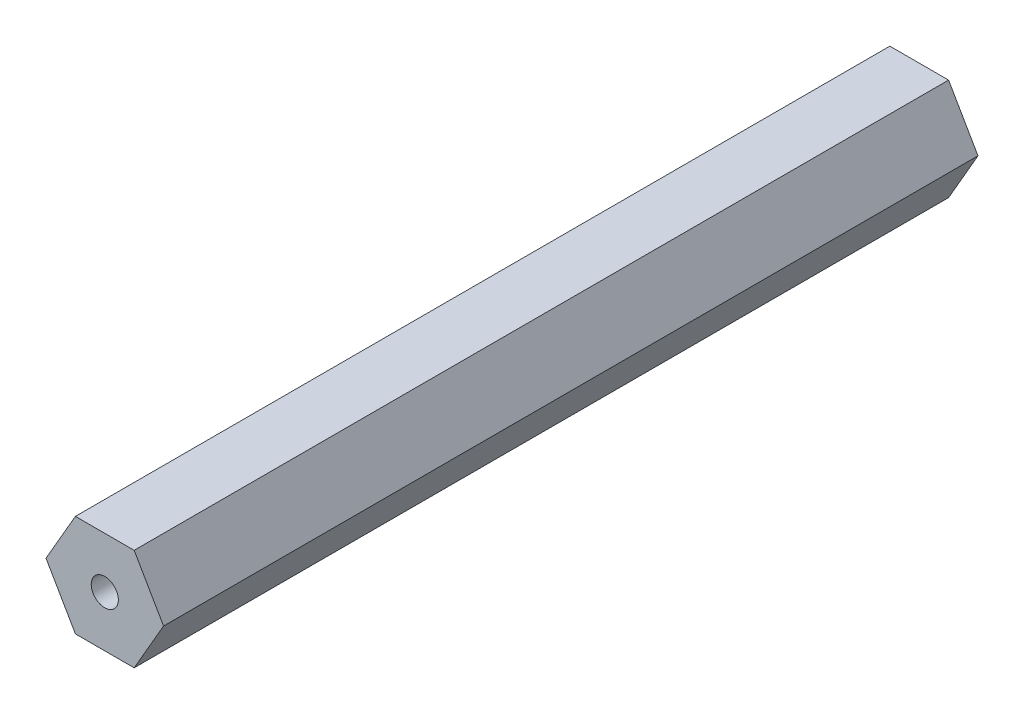
ISO-10303-21;
HEADER;
FILE_DESCRIPTION(('STEP AP214'),'2;1');
FILE_NAME('part.step','',(''),(''),'','','');
FILE_SCHEMA(('AUTOMOTIVE_DESIGN { 1 0 10303 214 1 1 1 1 }'));
ENDSEC;
DATA;
#1=APPLICATION_CONTEXT('core data for automotive mechanical design processes');
#2=APPLICATION_PROTOCOL_DEFINITION('international standard','automotive_design',2000,#1);
#3=PRODUCT_CONTEXT('',#1,'mechanical');
#4=PRODUCT('Part','Part','',(#3));
#5=PRODUCT_RELATED_PRODUCT_CATEGORY('part','',(#4));
#6=PRODUCT_DEFINITION_FORMATION('','',#4);
#7=PRODUCT_DEFINITION_CONTEXT('part definition',#1,'design');
#8=PRODUCT_DEFINITION('design','',#6,#7);
#9=PRODUCT_DEFINITION_SHAPE('','',#8);
#10=(LENGTH_UNIT() NAMED_UNIT(*) SI_UNIT(.MILLI.,.METRE.));
#11=(NAMED_UNIT(*) PLANE_ANGLE_UNIT() SI_UNIT($,.RADIAN.));
#12=(NAMED_UNIT(*) SI_UNIT($,.STERADIAN.) SOLID_ANGLE_UNIT());
#13=UNCERTAINTY_MEASURE_WITH_UNIT(LENGTH_MEASURE(1.E-05),#10,'distance_accuracy_value','');
#14=(GEOMETRIC_REPRESENTATION_CONTEXT(3) GLOBAL_UNCERTAINTY_ASSIGNED_CONTEXT((#13)) GLOBAL_UNIT_ASSIGNED_CONTEXT((#10,
#11,#12)) REPRESENTATION_CONTEXT('',''));
#15=CARTESIAN_POINT('',(0.,0.,0.));
#16=DIRECTION('',(0.,0.,1.));
#17=DIRECTION('',(1.,0.,0.));
#18=AXIS2_PLACEMENT_3D('',#15,#16,#17);
#19=CARTESIAN_POINT('',(0.,0.,76.2));
#20=DIRECTION('',(0.,0.,1.));
#21=DIRECTION('',(1.,0.,0.));
#22=AXIS2_PLACEMENT_3D('',#19,#20,#21);
#23=PLANE('',#22);
#24=DIRECTION('',(0.5,0.866025403784439,0.));
#25=VECTOR('',#24,1.);
#26=CARTESIAN_POINT('',(13.6584086693048,-7.43009006412703,76.2));
#27=LINE('',#26,#25);
#28=CARTESIAN_POINT('',(13.6584086693048,-7.43009006412703,76.2));
#29=VERTEX_POINT('',#28);
#30=CARTESIAN_POINT('',(16.4080393263204,-2.66759006412703,76.2));
#31=VERTEX_POINT('',#30);
#32=EDGE_CURVE('E133',#29,#31,#27,.T.);
#33=ORIENTED_EDGE('',*,*,#32,.T.);
#34=DIRECTION('',(-0.5,0.866025403784439,0.));
#35=VECTOR('',#34,1.);
#36=CARTESIAN_POINT('',(16.4080393263204,-2.66759006412703,76.2));
#37=LINE('',#36,#35);
#38=CARTESIAN_POINT('',(13.6584086693048,2.09490993587297,76.2));
#39=VERTEX_POINT('',#38);
#40=EDGE_CURVE('E91',#31,#39,#37,.T.);
#41=ORIENTED_EDGE('',*,*,#40,.T.);
#42=DIRECTION('',(-1.,0.,0.));
#43=VECTOR('',#42,1.);
#44=CARTESIAN_POINT('',(13.6584086693048,2.09490993587297,76.2));
#45=LINE('',#44,#43);
#46=CARTESIAN_POINT('',(8.1591473552736,2.09490993587297,76.2));
#47=VERTEX_POINT('',#46);
#48=EDGE_CURVE('E104',#39,#47,#45,.T.);
#49=ORIENTED_EDGE('',*,*,#48,.T.);
#50=DIRECTION('',(-0.5,-0.866025403784439,0.));
#51=VECTOR('',#50,1.);
#52=CARTESIAN_POINT('',(8.1591473552736,2.09490993587297,76.2));
#53=LINE('',#52,#51);
#54=CARTESIAN_POINT('',(5.40951669825801,-2.66759006412703,76.2));
#55=VERTEX_POINT('',#54);
#56=EDGE_CURVE('E98',#47,#55,#53,.T.);
#57=ORIENTED_EDGE('',*,*,#56,.T.);
#58=DIRECTION('',(0.5,-0.866025403784438,0.));
#59=VECTOR('',#58,1.);
#60=CARTESIAN_POINT('',(5.40951669825801,-2.66759006412703,76.2));
#61=LINE('',#60,#59);
#62=CARTESIAN_POINT('',(8.1591473552736,-7.43009006412703,76.2));
#63=VERTEX_POINT('',#62);
#64=EDGE_CURVE('E102',#55,#63,#61,.T.);
#65=ORIENTED_EDGE('',*,*,#64,.T.);
#66=DIRECTION('',(1.,0.,0.));
#67=VECTOR('',#66,1.);
#68=CARTESIAN_POINT('',(8.1591473552736,-7.43009006412703,76.2));
#69=LINE('',#68,#67);
#70=EDGE_CURVE('E54',#63,#29,#69,.T.);
#71=ORIENTED_EDGE('',*,*,#70,.T.);
#72=EDGE_LOOP('',(#33,#41,#49,#57,#65,#71));
#73=FACE_BOUND('',#72,.T.);
#74=CARTESIAN_POINT('',(10.9087780122892,-2.66759006412703,76.2));
#75=DIRECTION('',(0.,0.,1.));
#76=DIRECTION('',(1.,0.,0.));
#77=AXIS2_PLACEMENT_3D('',#74,#75,#76);
#78=CIRCLE('',#77,1.27);
#79=CARTESIAN_POINT('',(9.63877801228919,-2.66759006412703,76.2));
#80=VERTEX_POINT('',#79);
#81=EDGE_CURVE('E126',#80,#80,#78,.T.);
#82=ORIENTED_EDGE('',*,*,#81,.F.);
#83=EDGE_LOOP('',(#82));
#84=FACE_BOUND('',#83,.T.);
#85=ADVANCED_FACE('F37',(#73,#84),#23,.T.);
#86=CARTESIAN_POINT('',(0.,0.,0.));
#87=DIRECTION('',(0.,0.,1.));
#88=DIRECTION('',(1.,0.,0.));
#89=AXIS2_PLACEMENT_3D('',#86,#87,#88);
#90=PLANE('',#89);
#91=DIRECTION('',(0.5,0.866025403784439,0.));
#92=VECTOR('',#91,1.);
#93=CARTESIAN_POINT('',(13.6584086693048,-7.43009006412703,0.));
#94=LINE('',#93,#92);
#95=CARTESIAN_POINT('',(13.6584086693048,-7.43009006412703,0.));
#96=VERTEX_POINT('',#95);
#97=CARTESIAN_POINT('',(16.4080393263204,-2.66759006412703,0.));
#98=VERTEX_POINT('',#97);
#99=EDGE_CURVE('E122',#96,#98,#94,.T.);
#100=ORIENTED_EDGE('',*,*,#99,.F.);
#101=DIRECTION('',(1.,0.,0.));
#102=VECTOR('',#101,1.);
#103=CARTESIAN_POINT('',(8.1591473552736,-7.43009006412703,0.));
#104=LINE('',#103,#102);
#105=CARTESIAN_POINT('',(8.1591473552736,-7.43009006412703,0.));
#106=VERTEX_POINT('',#105);
#107=EDGE_CURVE('E83',#106,#96,#104,.T.);
#108=ORIENTED_EDGE('',*,*,#107,.F.);
#109=DIRECTION('',(0.5,-0.866025403784438,0.));
#110=VECTOR('',#109,1.);
#111=CARTESIAN_POINT('',(5.40951669825801,-2.66759006412703,0.));
#112=LINE('',#111,#110);
#113=CARTESIAN_POINT('',(5.40951669825801,-2.66759006412703,0.));
#114=VERTEX_POINT('',#113);
#115=EDGE_CURVE('E77',#114,#106,#112,.T.);
#116=ORIENTED_EDGE('',*,*,#115,.F.);
#117=DIRECTION('',(-0.5,-0.866025403784439,0.));
#118=VECTOR('',#117,1.);
#119=CARTESIAN_POINT('',(8.1591473552736,2.09490993587297,0.));
#120=LINE('',#119,#118);
#121=CARTESIAN_POINT('',(8.1591473552736,2.09490993587297,0.));
#122=VERTEX_POINT('',#121);
#123=EDGE_CURVE('E112',#122,#114,#120,.T.);
#124=ORIENTED_EDGE('',*,*,#123,.F.);
#125=DIRECTION('',(-1.,0.,0.));
#126=VECTOR('',#125,1.);
#127=CARTESIAN_POINT('',(13.6584086693048,2.09490993587297,0.));
#128=LINE('',#127,#126);
#129=CARTESIAN_POINT('',(13.6584086693048,2.09490993587297,0.));
#130=VERTEX_POINT('',#129);
#131=EDGE_CURVE('E128',#130,#122,#128,.T.);
#132=ORIENTED_EDGE('',*,*,#131,.F.);
#133=DIRECTION('',(-0.5,0.866025403784439,0.));
#134=VECTOR('',#133,1.);
#135=CARTESIAN_POINT('',(16.4080393263204,-2.66759006412703,0.));
#136=LINE('',#135,#134);
#137=EDGE_CURVE('E125',#98,#130,#136,.T.);
#138=ORIENTED_EDGE('',*,*,#137,.F.);
#139=EDGE_LOOP('',(#100,#108,#116,#124,#132,#138));
#140=FACE_BOUND('',#139,.T.);
#141=CARTESIAN_POINT('',(10.9087780122892,-2.66759006412703,0.));
#142=DIRECTION('',(0.,0.,1.));
#143=DIRECTION('',(1.,0.,0.));
#144=AXIS2_PLACEMENT_3D('',#141,#142,#143);
#145=CIRCLE('',#144,1.27);
#146=CARTESIAN_POINT('',(9.63877801228919,-2.66759006412703,0.));
#147=VERTEX_POINT('',#146);
#148=EDGE_CURVE('E244',#147,#147,#145,.T.);
#149=ORIENTED_EDGE('',*,*,#148,.T.);
#150=EDGE_LOOP('',(#149));
#151=FACE_BOUND('',#150,.T.);
#152=ADVANCED_FACE('F142',(#140,#151),#90,.F.);
#153=CARTESIAN_POINT('',(13.6584086693048,-7.43009006412703,76.2));
#154=DIRECTION('',(-0.866025403784439,0.5,0.));
#155=DIRECTION('',(-0.5,-0.866025403784439,0.));
#156=AXIS2_PLACEMENT_3D('',#153,#154,#155);
#157=PLANE('',#156);
#158=ORIENTED_EDGE('',*,*,#99,.T.);
#159=DIRECTION('',(0.,0.,-1.));
#160=VECTOR('',#159,1.);
#161=CARTESIAN_POINT('',(16.4080393263204,-2.66759006412703,76.2));
#162=LINE('',#161,#160);
#163=EDGE_CURVE('E11',#31,#98,#162,.T.);
#164=ORIENTED_EDGE('',*,*,#163,.F.);
#165=ORIENTED_EDGE('',*,*,#32,.F.);
#166=DIRECTION('',(0.,0.,-1.));
#167=VECTOR('',#166,1.);
#168=CARTESIAN_POINT('',(13.6584086693048,-7.43009006412703,76.2));
#169=LINE('',#168,#167);
#170=EDGE_CURVE('E118',#29,#96,#169,.T.);
#171=ORIENTED_EDGE('',*,*,#170,.T.);
#172=EDGE_LOOP('',(#158,#164,#165,#171));
#173=FACE_BOUND('',#172,.T.);
#174=ADVANCED_FACE('F39',(#173),#157,.F.);
#175=CARTESIAN_POINT('',(16.4080393263204,-2.66759006412703,76.2));
#176=DIRECTION('',(-0.866025403784439,-0.5,0.));
#177=DIRECTION('',(0.5,-0.866025403784439,0.));
#178=AXIS2_PLACEMENT_3D('',#175,#176,#177);
#179=PLANE('',#178);
#180=ORIENTED_EDGE('',*,*,#137,.T.);
#181=DIRECTION('',(0.,0.,-1.));
#182=VECTOR('',#181,1.);
#183=CARTESIAN_POINT('',(13.6584086693048,2.09490993587297,76.2));
#184=LINE('',#183,#182);
#185=EDGE_CURVE('E46',#39,#130,#184,.T.);
#186=ORIENTED_EDGE('',*,*,#185,.F.);
#187=ORIENTED_EDGE('',*,*,#40,.F.);
#188=ORIENTED_EDGE('',*,*,#163,.T.);
#189=EDGE_LOOP('',(#180,#186,#187,#188));
#190=FACE_BOUND('',#189,.T.);
#191=ADVANCED_FACE('F167',(#190),#179,.F.);
#192=CARTESIAN_POINT('',(13.6584086693048,2.09490993587297,76.2));
#193=DIRECTION('',(0.,-1.,0.));
#194=DIRECTION('',(0.,0.,-1.));
#195=AXIS2_PLACEMENT_3D('',#192,#193,#194);
#196=PLANE('',#195);
#197=ORIENTED_EDGE('',*,*,#131,.T.);
#198=DIRECTION('',(0.,0.,-1.));
#199=VECTOR('',#198,1.);
#200=CARTESIAN_POINT('',(8.1591473552736,2.09490993587297,76.2));
#201=LINE('',#200,#199);
#202=EDGE_CURVE('E113',#47,#122,#201,.T.);
#203=ORIENTED_EDGE('',*,*,#202,.F.);
#204=ORIENTED_EDGE('',*,*,#48,.F.);
#205=ORIENTED_EDGE('',*,*,#185,.T.);
#206=EDGE_LOOP('',(#197,#203,#204,#205));
#207=FACE_BOUND('',#206,.T.);
#208=ADVANCED_FACE('F139',(#207),#196,.F.);
#209=CARTESIAN_POINT('',(8.1591473552736,2.09490993587297,76.2));
#210=DIRECTION('',(0.866025403784439,-0.5,0.));
#211=DIRECTION('',(0.5,0.866025403784438,0.));
#212=AXIS2_PLACEMENT_3D('',#209,#210,#211);
#213=PLANE('',#212);
#214=ORIENTED_EDGE('',*,*,#123,.T.);
#215=DIRECTION('',(0.,0.,-1.));
#216=VECTOR('',#215,1.);
#217=CARTESIAN_POINT('',(5.40951669825801,-2.66759006412703,76.2));
#218=LINE('',#217,#216);
#219=EDGE_CURVE('E109',#55,#114,#218,.T.);
#220=ORIENTED_EDGE('',*,*,#219,.F.);
#221=ORIENTED_EDGE('',*,*,#56,.F.);
#222=ORIENTED_EDGE('',*,*,#202,.T.);
#223=EDGE_LOOP('',(#214,#220,#221,#222));
#224=FACE_BOUND('',#223,.T.);
#225=ADVANCED_FACE('F110',(#224),#213,.F.);
#226=CARTESIAN_POINT('',(5.40951669825801,-2.66759006412703,76.2));
#227=DIRECTION('',(0.866025403784438,0.5,0.));
#228=DIRECTION('',(-0.5,0.866025403784438,0.));
#229=AXIS2_PLACEMENT_3D('',#226,#227,#228);
#230=PLANE('',#229);
#231=ORIENTED_EDGE('',*,*,#115,.T.);
#232=DIRECTION('',(0.,0.,-1.));
#233=VECTOR('',#232,1.);
#234=CARTESIAN_POINT('',(8.1591473552736,-7.43009006412703,76.2));
#235=LINE('',#234,#233);
#236=EDGE_CURVE('E114',#63,#106,#235,.T.);
#237=ORIENTED_EDGE('',*,*,#236,.F.);
#238=ORIENTED_EDGE('',*,*,#64,.F.);
#239=ORIENTED_EDGE('',*,*,#219,.T.);
#240=EDGE_LOOP('',(#231,#237,#238,#239));
#241=FACE_BOUND('',#240,.T.);
#242=ADVANCED_FACE('F116',(#241),#230,.F.);
#243=CARTESIAN_POINT('',(8.1591473552736,-7.43009006412703,76.2));
#244=DIRECTION('',(0.,1.,0.));
#245=DIRECTION('',(-1.,0.,0.));
#246=AXIS2_PLACEMENT_3D('',#243,#244,#245);
#247=PLANE('',#246);
#248=ORIENTED_EDGE('',*,*,#107,.T.);
#249=ORIENTED_EDGE('',*,*,#170,.F.);
#250=ORIENTED_EDGE('',*,*,#70,.F.);
#251=ORIENTED_EDGE('',*,*,#236,.T.);
#252=EDGE_LOOP('',(#248,#249,#250,#251));
#253=FACE_BOUND('',#252,.T.);
#254=ADVANCED_FACE('F147',(#253),#247,.F.);
#255=CARTESIAN_POINT('',(10.9087780122892,-2.66759006412703,76.2));
#256=DIRECTION('',(0.,0.,-1.));
#257=DIRECTION('',(-1.,0.,0.));
#258=AXIS2_PLACEMENT_3D('',#255,#256,#257);
#259=CYLINDRICAL_SURFACE('',#258,1.27);
#260=CARTESIAN_POINT('',(9.63877801228919,-2.66759006412703,76.2));
#261=CARTESIAN_POINT('',(9.63877801228919,-2.66759006412703,75.40625));
#262=CARTESIAN_POINT('',(9.63877801228919,-2.66759006412703,74.6125));
#263=CARTESIAN_POINT('',(9.63877801228919,-2.66759006412703,73.025));
#264=CARTESIAN_POINT('',(9.63877801228919,-2.66759006412703,72.23125));
#265=CARTESIAN_POINT('',(9.63877801228919,-2.66759006412703,70.64375));
#266=CARTESIAN_POINT('',(9.63877801228919,-2.66759006412703,69.85));
#267=CARTESIAN_POINT('',(9.63877801228919,-2.66759006412703,68.2625));
#268=CARTESIAN_POINT('',(9.63877801228919,-2.66759006412703,67.46875));
#269=CARTESIAN_POINT('',(9.63877801228919,-2.66759006412703,65.88125));
#270=CARTESIAN_POINT('',(9.63877801228919,-2.66759006412703,65.0875));
#271=CARTESIAN_POINT('',(9.63877801228919,-2.66759006412703,63.5));
#272=CARTESIAN_POINT('',(9.63877801228919,-2.66759006412703,62.70625));
#273=CARTESIAN_POINT('',(9.63877801228919,-2.66759006412703,61.11875));
#274=CARTESIAN_POINT('',(9.63877801228919,-2.66759006412703,60.325));
#275=CARTESIAN_POINT('',(9.63877801228919,-2.66759006412703,58.7375));
#276=CARTESIAN_POINT('',(9.63877801228919,-2.66759006412703,57.94375));
#277=CARTESIAN_POINT('',(9.63877801228919,-2.66759006412703,56.35625));
#278=CARTESIAN_POINT('',(9.63877801228919,-2.66759006412703,55.5625));
#279=CARTESIAN_POINT('',(9.63877801228919,-2.66759006412703,53.975));
#280=CARTESIAN_POINT('',(9.63877801228919,-2.66759006412703,53.18125));
#281=CARTESIAN_POINT('',(9.63877801228919,-2.66759006412703,51.59375));
#282=CARTESIAN_POINT('',(9.63877801228919,-2.66759006412703,50.8));
#283=CARTESIAN_POINT('',(9.63877801228919,-2.66759006412703,49.2125));
#284=CARTESIAN_POINT('',(9.63877801228919,-2.66759006412703,48.41875));
#285=CARTESIAN_POINT('',(9.63877801228919,-2.66759006412703,46.83125));
#286=CARTESIAN_POINT('',(9.63877801228919,-2.66759006412703,46.0375));
#287=CARTESIAN_POINT('',(9.63877801228919,-2.66759006412703,44.45));
#288=CARTESIAN_POINT('',(9.63877801228919,-2.66759006412703,43.65625));
#289=CARTESIAN_POINT('',(9.63877801228919,-2.66759006412703,42.06875));
#290=CARTESIAN_POINT('',(9.63877801228919,-2.66759006412703,41.275));
#291=CARTESIAN_POINT('',(9.63877801228919,-2.66759006412703,39.6875));
#292=CARTESIAN_POINT('',(9.63877801228919,-2.66759006412703,38.89375));
#293=CARTESIAN_POINT('',(9.63877801228919,-2.66759006412703,37.30625));
#294=CARTESIAN_POINT('',(9.63877801228919,-2.66759006412703,36.5125));
#295=CARTESIAN_POINT('',(9.63877801228919,-2.66759006412703,34.925));
#296=CARTESIAN_POINT('',(9.63877801228919,-2.66759006412703,34.13125));
#297=CARTESIAN_POINT('',(9.63877801228919,-2.66759006412703,32.54375));
#298=CARTESIAN_POINT('',(9.63877801228919,-2.66759006412703,31.75));
#299=CARTESIAN_POINT('',(9.63877801228919,-2.66759006412703,30.1625));
#300=CARTESIAN_POINT('',(9.63877801228919,-2.66759006412703,29.36875));
#301=CARTESIAN_POINT('',(9.63877801228919,-2.66759006412703,27.78125));
#302=CARTESIAN_POINT('',(9.63877801228919,-2.66759006412703,26.9875));
#303=CARTESIAN_POINT('',(9.63877801228919,-2.66759006412703,25.4));
#304=CARTESIAN_POINT('',(9.63877801228919,-2.66759006412703,24.60625));
#305=CARTESIAN_POINT('',(9.63877801228919,-2.66759006412703,23.01875));
#306=CARTESIAN_POINT('',(9.63877801228919,-2.66759006412703,22.225));
#307=CARTESIAN_POINT('',(9.63877801228919,-2.66759006412703,20.6375));
#308=CARTESIAN_POINT('',(9.63877801228919,-2.66759006412703,19.84375));
#309=CARTESIAN_POINT('',(9.63877801228919,-2.66759006412703,18.25625));
#310=CARTESIAN_POINT('',(9.63877801228919,-2.66759006412703,17.4625));
#311=CARTESIAN_POINT('',(9.63877801228919,-2.66759006412703,15.875));
#312=CARTESIAN_POINT('',(9.63877801228919,-2.66759006412703,15.08125));
#313=CARTESIAN_POINT('',(9.63877801228919,-2.66759006412703,13.49375));
#314=CARTESIAN_POINT('',(9.63877801228919,-2.66759006412703,12.7));
#315=CARTESIAN_POINT('',(9.63877801228919,-2.66759006412703,11.1125));
#316=CARTESIAN_POINT('',(9.63877801228919,-2.66759006412703,10.31875));
#317=CARTESIAN_POINT('',(9.63877801228919,-2.66759006412703,8.73125));
#318=CARTESIAN_POINT('',(9.63877801228919,-2.66759006412703,7.93750000000001));
#319=CARTESIAN_POINT('',(9.63877801228919,-2.66759006412703,6.35));
#320=CARTESIAN_POINT('',(9.63877801228919,-2.66759006412703,5.55625));
#321=CARTESIAN_POINT('',(9.63877801228919,-2.66759006412703,3.96875));
#322=CARTESIAN_POINT('',(9.63877801228919,-2.66759006412703,3.175));
#323=CARTESIAN_POINT('',(9.63877801228919,-2.66759006412703,1.5875));
#324=CARTESIAN_POINT('',(9.63877801228919,-2.66759006412703,0.793750000000001));
#325=CARTESIAN_POINT('',(9.63877801228919,-2.66759006412703,0.));
#326=B_SPLINE_CURVE_WITH_KNOTS('',3,(#260,#261,#262,#263,#264,#265,#266,#267,#268,#269,#270,
#271,#272,#273,#274,#275,#276,#277,#278,#279,#280,#281,#282,#283,#284,#285,#286,#287,#288,#289,
#290,#291,#292,#293,#294,#295,#296,#297,#298,#299,#300,#301,#302,#303,#304,#305,#306,#307,#308,
#309,#310,#311,#312,#313,#314,#315,#316,#317,#318,#319,#320,#321,#322,#323,#324,#325),
.UNSPECIFIED.,.F.,.F.,(4,2,2,2,2,2,2,2,2,2,2,2,2,2,2,2,2,2,2,2,2,2,2,2,2,2,2,2,2,2,2,2,4),(0.,
2.38124999999999,4.76249999999999,7.14374999999999,9.52499999999999,11.90625,14.2875,16.66875,
19.05,21.43125,23.8125,26.19375,28.575,30.95625,33.3375,35.71875,38.1,40.48125,42.8625,45.24375,
47.625,50.00625,52.3875,54.76875,57.15,59.53125,61.9125,64.29375,66.675,69.05625,71.4375,
73.81875,76.2),.UNSPECIFIED.);
#327=EDGE_CURVE('BSEAM149',#80,#147,#326,.T.);
#328=ORIENTED_EDGE('',*,*,#81,.T.);
#329=ORIENTED_EDGE('',*,*,#148,.F.);
#330=ORIENTED_EDGE('',*,*,#327,.T.);
#331=ORIENTED_EDGE('',*,*,#327,.F.);
#332=EDGE_LOOP('',(#328,#330,#329,#331));
#333=FACE_BOUND('',#332,.T.);
#334=ADVANCED_FACE('F149',(#333),#259,.F.);
#335=CLOSED_SHELL('',(#85,#152,#174,#191,#208,#225,#242,#254,#334));
#336=MANIFOLD_SOLID_BREP('B2',#335);
#337=ADVANCED_BREP_SHAPE_REPRESENTATION('',(#18,#336),#14);
#338=SHAPE_DEFINITION_REPRESENTATION(#9,#337);
ENDSEC;
END-ISO-10303-21;
